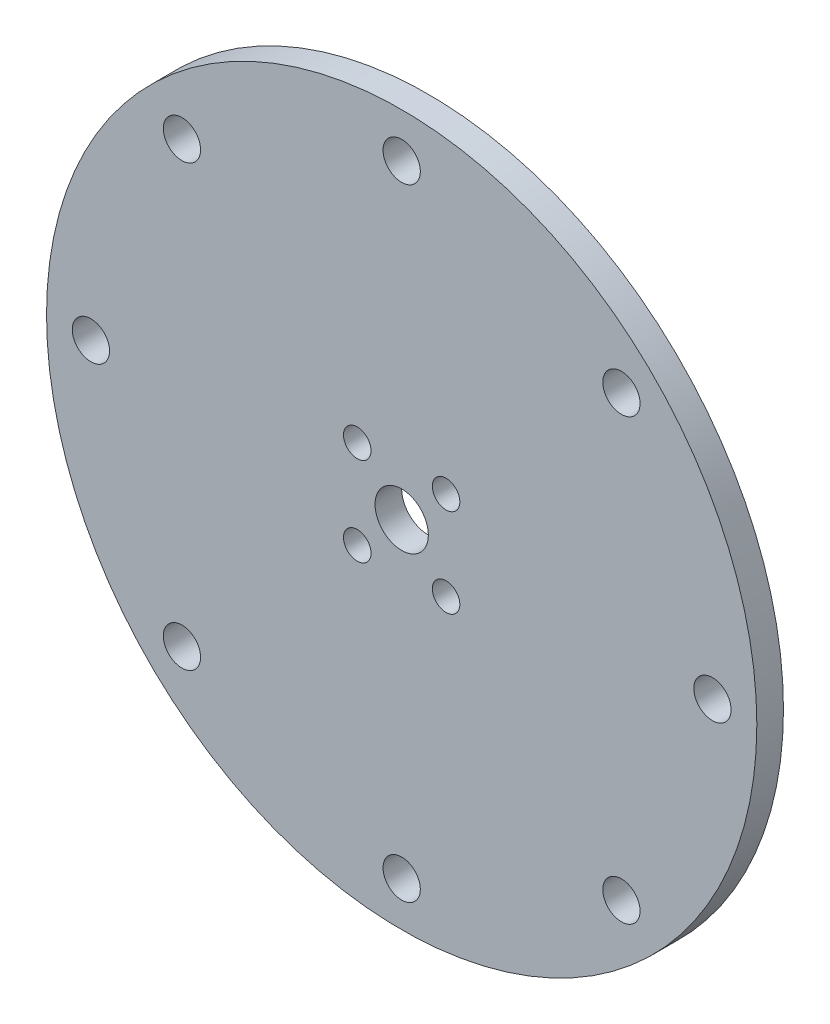
ISO-10303-21;
HEADER;
FILE_DESCRIPTION(('STEP AP214'),'2;1');
FILE_NAME('part.step','',(''),(''),'','','');
FILE_SCHEMA(('AUTOMOTIVE_DESIGN { 1 0 10303 214 1 1 1 1 }'));
ENDSEC;
DATA;
#1=APPLICATION_CONTEXT('core data for automotive mechanical design processes');
#2=APPLICATION_PROTOCOL_DEFINITION('international standard','automotive_design',2000,#1);
#3=PRODUCT_CONTEXT('',#1,'mechanical');
#4=PRODUCT('Part','Part','',(#3));
#5=PRODUCT_RELATED_PRODUCT_CATEGORY('part','',(#4));
#6=PRODUCT_DEFINITION_FORMATION('','',#4);
#7=PRODUCT_DEFINITION_CONTEXT('part definition',#1,'design');
#8=PRODUCT_DEFINITION('design','',#6,#7);
#9=PRODUCT_DEFINITION_SHAPE('','',#8);
#10=(LENGTH_UNIT() NAMED_UNIT(*) SI_UNIT(.MILLI.,.METRE.));
#11=(NAMED_UNIT(*) PLANE_ANGLE_UNIT() SI_UNIT($,.RADIAN.));
#12=(NAMED_UNIT(*) SI_UNIT($,.STERADIAN.) SOLID_ANGLE_UNIT());
#13=UNCERTAINTY_MEASURE_WITH_UNIT(LENGTH_MEASURE(1.E-05),#10,'distance_accuracy_value','');
#14=(GEOMETRIC_REPRESENTATION_CONTEXT(3) GLOBAL_UNCERTAINTY_ASSIGNED_CONTEXT((#13)) GLOBAL_UNIT_ASSIGNED_CONTEXT((#10,
#11,#12)) REPRESENTATION_CONTEXT('',''));
#15=CARTESIAN_POINT('',(0.,0.,0.));
#16=DIRECTION('',(0.,0.,1.));
#17=DIRECTION('',(1.,0.,0.));
#18=AXIS2_PLACEMENT_3D('',#15,#16,#17);
#19=CARTESIAN_POINT('',(0.,0.,3.));
#20=DIRECTION('',(0.,0.,1.));
#21=DIRECTION('',(1.,0.,0.));
#22=AXIS2_PLACEMENT_3D('',#19,#20,#21);
#23=PLANE('',#22);
#24=CARTESIAN_POINT('',(-5.00000000000005,-4.99999999999995,3.));
#25=DIRECTION('',(0.,0.,1.));
#26=DIRECTION('',(1.,0.,0.));
#27=AXIS2_PLACEMENT_3D('',#24,#25,#26);
#28=CIRCLE('',#27,1.55);
#29=CARTESIAN_POINT('',(-3.45000000000005,-4.99999999999995,3.));
#30=VERTEX_POINT('',#29);
#31=EDGE_CURVE('E159',#30,#30,#28,.T.);
#32=ORIENTED_EDGE('',*,*,#31,.F.);
#33=EDGE_LOOP('',(#32));
#34=FACE_BOUND('',#33,.T.);
#35=CARTESIAN_POINT('',(4.99999999999997,-5.00000000000003,3.));
#36=DIRECTION('',(0.,0.,1.));
#37=DIRECTION('',(1.,0.,0.));
#38=AXIS2_PLACEMENT_3D('',#35,#36,#37);
#39=CIRCLE('',#38,1.55);
#40=CARTESIAN_POINT('',(6.54999999999997,-5.00000000000003,3.));
#41=VERTEX_POINT('',#40);
#42=EDGE_CURVE('E163',#41,#41,#39,.T.);
#43=ORIENTED_EDGE('',*,*,#42,.F.);
#44=EDGE_LOOP('',(#43));
#45=FACE_BOUND('',#44,.T.);
#46=CARTESIAN_POINT('',(5.00000000000002,4.99999999999998,3.));
#47=DIRECTION('',(0.,0.,1.));
#48=DIRECTION('',(1.,0.,0.));
#49=AXIS2_PLACEMENT_3D('',#46,#47,#48);
#50=CIRCLE('',#49,1.55);
#51=CARTESIAN_POINT('',(6.55000000000002,4.99999999999998,3.));
#52=VERTEX_POINT('',#51);
#53=EDGE_CURVE('E158',#52,#52,#50,.T.);
#54=ORIENTED_EDGE('',*,*,#53,.F.);
#55=EDGE_LOOP('',(#54));
#56=FACE_BOUND('',#55,.T.);
#57=CARTESIAN_POINT('',(-5.,5.,3.));
#58=DIRECTION('',(0.,0.,1.));
#59=DIRECTION('',(1.,0.,0.));
#60=AXIS2_PLACEMENT_3D('',#57,#58,#59);
#61=CIRCLE('',#60,1.55);
#62=CARTESIAN_POINT('',(-3.45,5.,3.));
#63=VERTEX_POINT('',#62);
#64=EDGE_CURVE('E110',#63,#63,#61,.T.);
#65=ORIENTED_EDGE('',*,*,#64,.F.);
#66=EDGE_LOOP('',(#65));
#67=FACE_BOUND('',#66,.T.);
#68=CARTESIAN_POINT('',(1.17915583062494E-13,35.,3.));
#69=DIRECTION('',(0.,0.,1.));
#70=DIRECTION('',(1.,0.,0.));
#71=AXIS2_PLACEMENT_3D('',#68,#69,#70);
#72=CIRCLE('',#71,2.1);
#73=CARTESIAN_POINT('',(2.10000000000012,35.,3.));
#74=VERTEX_POINT('',#73);
#75=EDGE_CURVE('E78',#74,#74,#72,.T.);
#76=ORIENTED_EDGE('',*,*,#75,.F.);
#77=EDGE_LOOP('',(#76));
#78=FACE_BOUND('',#77,.T.);
#79=CARTESIAN_POINT('',(24.7487373415293,24.748737341529,3.));
#80=DIRECTION('',(0.,0.,1.));
#81=DIRECTION('',(1.,0.,0.));
#82=AXIS2_PLACEMENT_3D('',#79,#80,#81);
#83=CIRCLE('',#82,2.1);
#84=CARTESIAN_POINT('',(26.8487373415293,24.748737341529,3.));
#85=VERTEX_POINT('',#84);
#86=EDGE_CURVE('E148',#85,#85,#83,.T.);
#87=ORIENTED_EDGE('',*,*,#86,.F.);
#88=EDGE_LOOP('',(#87));
#89=FACE_BOUND('',#88,.T.);
#90=CARTESIAN_POINT('',(35.,-2.40117429922004E-13,3.));
#91=DIRECTION('',(0.,0.,1.));
#92=DIRECTION('',(1.,0.,0.));
#93=AXIS2_PLACEMENT_3D('',#90,#91,#92);
#94=CIRCLE('',#93,2.1);
#95=CARTESIAN_POINT('',(37.1,-2.40117429922004E-13,3.));
#96=VERTEX_POINT('',#95);
#97=EDGE_CURVE('E144',#96,#96,#94,.T.);
#98=ORIENTED_EDGE('',*,*,#97,.F.);
#99=EDGE_LOOP('',(#98));
#100=FACE_BOUND('',#99,.T.);
#101=CARTESIAN_POINT('',(24.748737341529,-24.7487373415294,3.));
#102=DIRECTION('',(0.,0.,1.));
#103=DIRECTION('',(1.,0.,0.));
#104=AXIS2_PLACEMENT_3D('',#101,#102,#103);
#105=CIRCLE('',#104,2.1);
#106=CARTESIAN_POINT('',(26.8487373415289,-24.7487373415294,3.));
#107=VERTEX_POINT('',#106);
#108=EDGE_CURVE('E140',#107,#107,#105,.T.);
#109=ORIENTED_EDGE('',*,*,#108,.F.);
#110=EDGE_LOOP('',(#109));
#111=FACE_BOUND('',#110,.T.);
#112=CARTESIAN_POINT('',(-3.62319276781513E-13,-35.,3.));
#113=DIRECTION('',(0.,0.,1.));
#114=DIRECTION('',(1.,0.,0.));
#115=AXIS2_PLACEMENT_3D('',#112,#113,#114);
#116=CIRCLE('',#115,2.1);
#117=CARTESIAN_POINT('',(2.09999999999964,-35.,3.));
#118=VERTEX_POINT('',#117);
#119=EDGE_CURVE('E134',#118,#118,#116,.T.);
#120=ORIENTED_EDGE('',*,*,#119,.F.);
#121=EDGE_LOOP('',(#120));
#122=FACE_BOUND('',#121,.T.);
#123=CARTESIAN_POINT('',(-24.7487373415295,-24.7487373415289,3.));
#124=DIRECTION('',(0.,0.,1.));
#125=DIRECTION('',(1.,0.,0.));
#126=AXIS2_PLACEMENT_3D('',#123,#124,#125);
#127=CIRCLE('',#126,2.1);
#128=CARTESIAN_POINT('',(-22.6487373415295,-24.7487373415289,3.));
#129=VERTEX_POINT('',#128);
#130=EDGE_CURVE('E129',#129,#129,#127,.T.);
#131=ORIENTED_EDGE('',*,*,#130,.F.);
#132=EDGE_LOOP('',(#131));
#133=FACE_BOUND('',#132,.T.);
#134=CARTESIAN_POINT('',(-35.,4.84521123641023E-13,3.));
#135=DIRECTION('',(0.,0.,1.));
#136=DIRECTION('',(1.,0.,0.));
#137=AXIS2_PLACEMENT_3D('',#134,#135,#136);
#138=CIRCLE('',#137,2.1);
#139=CARTESIAN_POINT('',(-32.9,4.84521123641023E-13,3.));
#140=VERTEX_POINT('',#139);
#141=EDGE_CURVE('E124',#140,#140,#138,.T.);
#142=ORIENTED_EDGE('',*,*,#141,.F.);
#143=EDGE_LOOP('',(#142));
#144=FACE_BOUND('',#143,.T.);
#145=CARTESIAN_POINT('',(-24.7487373415288,24.7487373415296,3.));
#146=DIRECTION('',(0.,0.,1.));
#147=DIRECTION('',(1.,0.,0.));
#148=AXIS2_PLACEMENT_3D('',#145,#146,#147);
#149=CIRCLE('',#148,2.1);
#150=CARTESIAN_POINT('',(-22.6487373415288,24.7487373415296,3.));
#151=VERTEX_POINT('',#150);
#152=EDGE_CURVE('E62',#151,#151,#149,.T.);
#153=ORIENTED_EDGE('',*,*,#152,.F.);
#154=EDGE_LOOP('',(#153));
#155=FACE_BOUND('',#154,.T.);
#156=CARTESIAN_POINT('',(0.,0.,3.));
#157=DIRECTION('',(0.,0.,1.));
#158=DIRECTION('',(1.,0.,0.));
#159=AXIS2_PLACEMENT_3D('',#156,#157,#158);
#160=CIRCLE('',#159,40.);
#161=CARTESIAN_POINT('',(40.,0.,3.));
#162=VERTEX_POINT('',#161);
#163=EDGE_CURVE('E68',#162,#162,#160,.T.);
#164=ORIENTED_EDGE('',*,*,#163,.T.);
#165=EDGE_LOOP('',(#164));
#166=FACE_BOUND('',#165,.T.);
#167=CARTESIAN_POINT('',(0.,0.,3.));
#168=DIRECTION('',(0.,0.,1.));
#169=DIRECTION('',(1.,0.,0.));
#170=AXIS2_PLACEMENT_3D('',#167,#168,#169);
#171=CIRCLE('',#170,3.);
#172=CARTESIAN_POINT('',(3.,0.,3.));
#173=VERTEX_POINT('',#172);
#174=EDGE_CURVE('E53',#173,#173,#171,.T.);
#175=ORIENTED_EDGE('',*,*,#174,.F.);
#176=EDGE_LOOP('',(#175));
#177=FACE_BOUND('',#176,.T.);
#178=ADVANCED_FACE('F44',(#34,#45,#56,#67,#78,#89,#100,#111,#122,#133,#144,#155,#166,#177),#23,.T.);
#179=CARTESIAN_POINT('',(0.,0.,0.));
#180=DIRECTION('',(0.,0.,1.));
#181=DIRECTION('',(1.,0.,0.));
#182=AXIS2_PLACEMENT_3D('',#179,#180,#181);
#183=PLANE('',#182);
#184=CARTESIAN_POINT('',(-5.00000000000005,-4.99999999999995,0.));
#185=DIRECTION('',(0.,0.,1.));
#186=DIRECTION('',(1.,0.,0.));
#187=AXIS2_PLACEMENT_3D('',#184,#185,#186);
#188=CIRCLE('',#187,1.55);
#189=CARTESIAN_POINT('',(-3.45000000000005,-4.99999999999995,0.));
#190=VERTEX_POINT('',#189);
#191=EDGE_CURVE('E48',#190,#190,#188,.T.);
#192=ORIENTED_EDGE('',*,*,#191,.T.);
#193=EDGE_LOOP('',(#192));
#194=FACE_BOUND('',#193,.T.);
#195=CARTESIAN_POINT('',(4.99999999999997,-5.00000000000003,0.));
#196=DIRECTION('',(0.,0.,1.));
#197=DIRECTION('',(1.,0.,0.));
#198=AXIS2_PLACEMENT_3D('',#195,#196,#197);
#199=CIRCLE('',#198,1.55);
#200=CARTESIAN_POINT('',(6.54999999999997,-5.00000000000003,0.));
#201=VERTEX_POINT('',#200);
#202=EDGE_CURVE('E113',#201,#201,#199,.T.);
#203=ORIENTED_EDGE('',*,*,#202,.T.);
#204=EDGE_LOOP('',(#203));
#205=FACE_BOUND('',#204,.T.);
#206=CARTESIAN_POINT('',(5.00000000000002,4.99999999999998,0.));
#207=DIRECTION('',(0.,0.,1.));
#208=DIRECTION('',(1.,0.,0.));
#209=AXIS2_PLACEMENT_3D('',#206,#207,#208);
#210=CIRCLE('',#209,1.55);
#211=CARTESIAN_POINT('',(6.55000000000002,4.99999999999998,0.));
#212=VERTEX_POINT('',#211);
#213=EDGE_CURVE('E109',#212,#212,#210,.T.);
#214=ORIENTED_EDGE('',*,*,#213,.T.);
#215=EDGE_LOOP('',(#214));
#216=FACE_BOUND('',#215,.T.);
#217=CARTESIAN_POINT('',(-5.,5.,0.));
#218=DIRECTION('',(0.,0.,1.));
#219=DIRECTION('',(1.,0.,0.));
#220=AXIS2_PLACEMENT_3D('',#217,#218,#219);
#221=CIRCLE('',#220,1.55);
#222=CARTESIAN_POINT('',(-3.45,5.,0.));
#223=VERTEX_POINT('',#222);
#224=EDGE_CURVE('E105',#223,#223,#221,.T.);
#225=ORIENTED_EDGE('',*,*,#224,.T.);
#226=EDGE_LOOP('',(#225));
#227=FACE_BOUND('',#226,.T.);
#228=CARTESIAN_POINT('',(1.17915583062494E-13,35.,0.));
#229=DIRECTION('',(0.,0.,1.));
#230=DIRECTION('',(1.,0.,0.));
#231=AXIS2_PLACEMENT_3D('',#228,#229,#230);
#232=CIRCLE('',#231,2.1);
#233=CARTESIAN_POINT('',(2.10000000000012,35.,0.));
#234=VERTEX_POINT('',#233);
#235=EDGE_CURVE('E72',#234,#234,#232,.T.);
#236=ORIENTED_EDGE('',*,*,#235,.T.);
#237=EDGE_LOOP('',(#236));
#238=FACE_BOUND('',#237,.T.);
#239=CARTESIAN_POINT('',(24.7487373415293,24.748737341529,0.));
#240=DIRECTION('',(0.,0.,1.));
#241=DIRECTION('',(1.,0.,0.));
#242=AXIS2_PLACEMENT_3D('',#239,#240,#241);
#243=CIRCLE('',#242,2.1);
#244=CARTESIAN_POINT('',(26.8487373415293,24.748737341529,0.));
#245=VERTEX_POINT('',#244);
#246=EDGE_CURVE('E98',#245,#245,#243,.T.);
#247=ORIENTED_EDGE('',*,*,#246,.T.);
#248=EDGE_LOOP('',(#247));
#249=FACE_BOUND('',#248,.T.);
#250=CARTESIAN_POINT('',(35.,-2.40117429922004E-13,0.));
#251=DIRECTION('',(0.,0.,1.));
#252=DIRECTION('',(1.,0.,0.));
#253=AXIS2_PLACEMENT_3D('',#250,#251,#252);
#254=CIRCLE('',#253,2.1);
#255=CARTESIAN_POINT('',(37.1,-2.40117429922004E-13,0.));
#256=VERTEX_POINT('',#255);
#257=EDGE_CURVE('E94',#256,#256,#254,.T.);
#258=ORIENTED_EDGE('',*,*,#257,.T.);
#259=EDGE_LOOP('',(#258));
#260=FACE_BOUND('',#259,.T.);
#261=CARTESIAN_POINT('',(24.748737341529,-24.7487373415294,0.));
#262=DIRECTION('',(0.,0.,1.));
#263=DIRECTION('',(1.,0.,0.));
#264=AXIS2_PLACEMENT_3D('',#261,#262,#263);
#265=CIRCLE('',#264,2.1);
#266=CARTESIAN_POINT('',(26.8487373415289,-24.7487373415294,0.));
#267=VERTEX_POINT('',#266);
#268=EDGE_CURVE('E90',#267,#267,#265,.T.);
#269=ORIENTED_EDGE('',*,*,#268,.T.);
#270=EDGE_LOOP('',(#269));
#271=FACE_BOUND('',#270,.T.);
#272=CARTESIAN_POINT('',(-3.62319276781513E-13,-35.,0.));
#273=DIRECTION('',(0.,0.,1.));
#274=DIRECTION('',(1.,0.,0.));
#275=AXIS2_PLACEMENT_3D('',#272,#273,#274);
#276=CIRCLE('',#275,2.1);
#277=CARTESIAN_POINT('',(2.09999999999964,-35.,0.));
#278=VERTEX_POINT('',#277);
#279=EDGE_CURVE('E86',#278,#278,#276,.T.);
#280=ORIENTED_EDGE('',*,*,#279,.T.);
#281=EDGE_LOOP('',(#280));
#282=FACE_BOUND('',#281,.T.);
#283=CARTESIAN_POINT('',(-24.7487373415295,-24.7487373415289,0.));
#284=DIRECTION('',(0.,0.,1.));
#285=DIRECTION('',(1.,0.,0.));
#286=AXIS2_PLACEMENT_3D('',#283,#284,#285);
#287=CIRCLE('',#286,2.1);
#288=CARTESIAN_POINT('',(-22.6487373415295,-24.7487373415289,0.));
#289=VERTEX_POINT('',#288);
#290=EDGE_CURVE('E82',#289,#289,#287,.T.);
#291=ORIENTED_EDGE('',*,*,#290,.T.);
#292=EDGE_LOOP('',(#291));
#293=FACE_BOUND('',#292,.T.);
#294=CARTESIAN_POINT('',(-35.,4.84521123641023E-13,0.));
#295=DIRECTION('',(0.,0.,1.));
#296=DIRECTION('',(1.,0.,0.));
#297=AXIS2_PLACEMENT_3D('',#294,#295,#296);
#298=CIRCLE('',#297,2.1);
#299=CARTESIAN_POINT('',(-32.9,4.84521123641023E-13,0.));
#300=VERTEX_POINT('',#299);
#301=EDGE_CURVE('E77',#300,#300,#298,.T.);
#302=ORIENTED_EDGE('',*,*,#301,.T.);
#303=EDGE_LOOP('',(#302));
#304=FACE_BOUND('',#303,.T.);
#305=CARTESIAN_POINT('',(-24.7487373415288,24.7487373415296,0.));
#306=DIRECTION('',(0.,0.,1.));
#307=DIRECTION('',(1.,0.,0.));
#308=AXIS2_PLACEMENT_3D('',#305,#306,#307);
#309=CIRCLE('',#308,2.1);
#310=CARTESIAN_POINT('',(-22.6487373415288,24.7487373415296,0.));
#311=VERTEX_POINT('',#310);
#312=EDGE_CURVE('E73',#311,#311,#309,.T.);
#313=ORIENTED_EDGE('',*,*,#312,.T.);
#314=EDGE_LOOP('',(#313));
#315=FACE_BOUND('',#314,.T.);
#316=CARTESIAN_POINT('',(0.,0.,0.));
#317=DIRECTION('',(0.,0.,1.));
#318=DIRECTION('',(1.,0.,0.));
#319=AXIS2_PLACEMENT_3D('',#316,#317,#318);
#320=CIRCLE('',#319,3.);
#321=CARTESIAN_POINT('',(3.,0.,0.));
#322=VERTEX_POINT('',#321);
#323=EDGE_CURVE('E59',#322,#322,#320,.T.);
#324=ORIENTED_EDGE('',*,*,#323,.T.);
#325=EDGE_LOOP('',(#324));
#326=FACE_BOUND('',#325,.T.);
#327=CARTESIAN_POINT('',(0.,0.,0.));
#328=DIRECTION('',(0.,0.,1.));
#329=DIRECTION('',(1.,0.,0.));
#330=AXIS2_PLACEMENT_3D('',#327,#328,#329);
#331=CIRCLE('',#330,40.);
#332=CARTESIAN_POINT('',(40.,0.,0.));
#333=VERTEX_POINT('',#332);
#334=EDGE_CURVE('E10',#333,#333,#331,.T.);
#335=ORIENTED_EDGE('',*,*,#334,.F.);
#336=EDGE_LOOP('',(#335));
#337=FACE_BOUND('',#336,.T.);
#338=ADVANCED_FACE('F176',(#194,#205,#216,#227,#238,#249,#260,#271,#282,#293,#304,#315,#326,
#337),#183,.F.);
#339=CARTESIAN_POINT('',(0.,0.,0.));
#340=DIRECTION('',(0.,0.,1.));
#341=DIRECTION('',(1.,0.,0.));
#342=AXIS2_PLACEMENT_3D('',#339,#340,#341);
#343=CYLINDRICAL_SURFACE('',#342,3.);
#344=ORIENTED_EDGE('',*,*,#323,.F.);
#345=EDGE_LOOP('',(#344));
#346=FACE_BOUND('',#345,.T.);
#347=ORIENTED_EDGE('',*,*,#174,.T.);
#348=EDGE_LOOP('',(#347));
#349=FACE_BOUND('',#348,.T.);
#350=ADVANCED_FACE('F199',(#346,#349),#343,.F.);
#351=CARTESIAN_POINT('',(0.,0.,-32.));
#352=DIRECTION('',(0.,0.,1.));
#353=DIRECTION('',(1.,0.,0.));
#354=AXIS2_PLACEMENT_3D('',#351,#352,#353);
#355=CYLINDRICAL_SURFACE('',#354,40.);
#356=ORIENTED_EDGE('',*,*,#163,.F.);
#357=EDGE_LOOP('',(#356));
#358=FACE_BOUND('',#357,.T.);
#359=ORIENTED_EDGE('',*,*,#334,.T.);
#360=EDGE_LOOP('',(#359));
#361=FACE_BOUND('',#360,.T.);
#362=ADVANCED_FACE('F46',(#358,#361),#355,.T.);
#363=CARTESIAN_POINT('',(-24.7487373415288,24.7487373415296,-32.));
#364=DIRECTION('',(0.,0.,1.));
#365=DIRECTION('',(1.,0.,0.));
#366=AXIS2_PLACEMENT_3D('',#363,#364,#365);
#367=CYLINDRICAL_SURFACE('',#366,2.1);
#368=ORIENTED_EDGE('',*,*,#152,.T.);
#369=EDGE_LOOP('',(#368));
#370=FACE_BOUND('',#369,.T.);
#371=ORIENTED_EDGE('',*,*,#312,.F.);
#372=EDGE_LOOP('',(#371));
#373=FACE_BOUND('',#372,.T.);
#374=ADVANCED_FACE('F205',(#370,#373),#367,.F.);
#375=CARTESIAN_POINT('',(-35.,4.84521123641023E-13,-32.));
#376=DIRECTION('',(0.,0.,1.));
#377=DIRECTION('',(1.,0.,0.));
#378=AXIS2_PLACEMENT_3D('',#375,#376,#377);
#379=CYLINDRICAL_SURFACE('',#378,2.1);
#380=ORIENTED_EDGE('',*,*,#141,.T.);
#381=EDGE_LOOP('',(#380));
#382=FACE_BOUND('',#381,.T.);
#383=ORIENTED_EDGE('',*,*,#301,.F.);
#384=EDGE_LOOP('',(#383));
#385=FACE_BOUND('',#384,.T.);
#386=ADVANCED_FACE('F213',(#382,#385),#379,.F.);
#387=CARTESIAN_POINT('',(-24.7487373415295,-24.7487373415289,-32.));
#388=DIRECTION('',(0.,0.,1.));
#389=DIRECTION('',(1.,0.,0.));
#390=AXIS2_PLACEMENT_3D('',#387,#388,#389);
#391=CYLINDRICAL_SURFACE('',#390,2.1);
#392=ORIENTED_EDGE('',*,*,#130,.T.);
#393=EDGE_LOOP('',(#392));
#394=FACE_BOUND('',#393,.T.);
#395=ORIENTED_EDGE('',*,*,#290,.F.);
#396=EDGE_LOOP('',(#395));
#397=FACE_BOUND('',#396,.T.);
#398=ADVANCED_FACE('F216',(#394,#397),#391,.F.);
#399=CARTESIAN_POINT('',(-3.62319276781513E-13,-35.,-32.));
#400=DIRECTION('',(0.,0.,1.));
#401=DIRECTION('',(1.,0.,0.));
#402=AXIS2_PLACEMENT_3D('',#399,#400,#401);
#403=CYLINDRICAL_SURFACE('',#402,2.1);
#404=ORIENTED_EDGE('',*,*,#119,.T.);
#405=EDGE_LOOP('',(#404));
#406=FACE_BOUND('',#405,.T.);
#407=ORIENTED_EDGE('',*,*,#279,.F.);
#408=EDGE_LOOP('',(#407));
#409=FACE_BOUND('',#408,.T.);
#410=ADVANCED_FACE('F219',(#406,#409),#403,.F.);
#411=CARTESIAN_POINT('',(24.748737341529,-24.7487373415294,-32.));
#412=DIRECTION('',(0.,0.,1.));
#413=DIRECTION('',(1.,0.,0.));
#414=AXIS2_PLACEMENT_3D('',#411,#412,#413);
#415=CYLINDRICAL_SURFACE('',#414,2.1);
#416=ORIENTED_EDGE('',*,*,#108,.T.);
#417=EDGE_LOOP('',(#416));
#418=FACE_BOUND('',#417,.T.);
#419=ORIENTED_EDGE('',*,*,#268,.F.);
#420=EDGE_LOOP('',(#419));
#421=FACE_BOUND('',#420,.T.);
#422=ADVANCED_FACE('F223',(#418,#421),#415,.F.);
#423=CARTESIAN_POINT('',(35.,-2.40117429922004E-13,-32.));
#424=DIRECTION('',(0.,0.,1.));
#425=DIRECTION('',(1.,0.,0.));
#426=AXIS2_PLACEMENT_3D('',#423,#424,#425);
#427=CYLINDRICAL_SURFACE('',#426,2.1);
#428=ORIENTED_EDGE('',*,*,#97,.T.);
#429=EDGE_LOOP('',(#428));
#430=FACE_BOUND('',#429,.T.);
#431=ORIENTED_EDGE('',*,*,#257,.F.);
#432=EDGE_LOOP('',(#431));
#433=FACE_BOUND('',#432,.T.);
#434=ADVANCED_FACE('F227',(#430,#433),#427,.F.);
#435=CARTESIAN_POINT('',(24.7487373415293,24.748737341529,-32.));
#436=DIRECTION('',(0.,0.,1.));
#437=DIRECTION('',(1.,0.,0.));
#438=AXIS2_PLACEMENT_3D('',#435,#436,#437);
#439=CYLINDRICAL_SURFACE('',#438,2.1);
#440=ORIENTED_EDGE('',*,*,#86,.T.);
#441=EDGE_LOOP('',(#440));
#442=FACE_BOUND('',#441,.T.);
#443=ORIENTED_EDGE('',*,*,#246,.F.);
#444=EDGE_LOOP('',(#443));
#445=FACE_BOUND('',#444,.T.);
#446=ADVANCED_FACE('F231',(#442,#445),#439,.F.);
#447=CARTESIAN_POINT('',(1.17915583062494E-13,35.,-32.));
#448=DIRECTION('',(0.,0.,1.));
#449=DIRECTION('',(1.,0.,0.));
#450=AXIS2_PLACEMENT_3D('',#447,#448,#449);
#451=CYLINDRICAL_SURFACE('',#450,2.1);
#452=ORIENTED_EDGE('',*,*,#75,.T.);
#453=EDGE_LOOP('',(#452));
#454=FACE_BOUND('',#453,.T.);
#455=ORIENTED_EDGE('',*,*,#235,.F.);
#456=EDGE_LOOP('',(#455));
#457=FACE_BOUND('',#456,.T.);
#458=ADVANCED_FACE('F235',(#454,#457),#451,.F.);
#459=CARTESIAN_POINT('',(-5.,5.,-32.));
#460=DIRECTION('',(0.,0.,1.));
#461=DIRECTION('',(1.,0.,0.));
#462=AXIS2_PLACEMENT_3D('',#459,#460,#461);
#463=CYLINDRICAL_SURFACE('',#462,1.55);
#464=ORIENTED_EDGE('',*,*,#64,.T.);
#465=EDGE_LOOP('',(#464));
#466=FACE_BOUND('',#465,.T.);
#467=ORIENTED_EDGE('',*,*,#224,.F.);
#468=EDGE_LOOP('',(#467));
#469=FACE_BOUND('',#468,.T.);
#470=ADVANCED_FACE('F239',(#466,#469),#463,.F.);
#471=CARTESIAN_POINT('',(5.00000000000002,4.99999999999998,-32.));
#472=DIRECTION('',(0.,0.,1.));
#473=DIRECTION('',(1.,0.,0.));
#474=AXIS2_PLACEMENT_3D('',#471,#472,#473);
#475=CYLINDRICAL_SURFACE('',#474,1.55);
#476=ORIENTED_EDGE('',*,*,#53,.T.);
#477=EDGE_LOOP('',(#476));
#478=FACE_BOUND('',#477,.T.);
#479=ORIENTED_EDGE('',*,*,#213,.F.);
#480=EDGE_LOOP('',(#479));
#481=FACE_BOUND('',#480,.T.);
#482=ADVANCED_FACE('F171',(#478,#481),#475,.F.);
#483=CARTESIAN_POINT('',(4.99999999999997,-5.00000000000003,-32.));
#484=DIRECTION('',(0.,0.,1.));
#485=DIRECTION('',(1.,0.,0.));
#486=AXIS2_PLACEMENT_3D('',#483,#484,#485);
#487=CYLINDRICAL_SURFACE('',#486,1.55);
#488=ORIENTED_EDGE('',*,*,#42,.T.);
#489=EDGE_LOOP('',(#488));
#490=FACE_BOUND('',#489,.T.);
#491=ORIENTED_EDGE('',*,*,#202,.F.);
#492=EDGE_LOOP('',(#491));
#493=FACE_BOUND('',#492,.T.);
#494=ADVANCED_FACE('F247',(#490,#493),#487,.F.);
#495=CARTESIAN_POINT('',(-5.00000000000005,-4.99999999999995,-32.));
#496=DIRECTION('',(0.,0.,1.));
#497=DIRECTION('',(1.,0.,0.));
#498=AXIS2_PLACEMENT_3D('',#495,#496,#497);
#499=CYLINDRICAL_SURFACE('',#498,1.55);
#500=ORIENTED_EDGE('',*,*,#31,.T.);
#501=EDGE_LOOP('',(#500));
#502=FACE_BOUND('',#501,.T.);
#503=ORIENTED_EDGE('',*,*,#191,.F.);
#504=EDGE_LOOP('',(#503));
#505=FACE_BOUND('',#504,.T.);
#506=ADVANCED_FACE('F244',(#502,#505),#499,.F.);
#507=CLOSED_SHELL('',(#178,#338,#350,#362,#374,#386,#398,#410,#422,#434,#446,#458,#470,#482,
#494,#506));
#508=MANIFOLD_SOLID_BREP('B2',#507);
#509=ADVANCED_BREP_SHAPE_REPRESENTATION('',(#18,#508),#14);
#510=SHAPE_DEFINITION_REPRESENTATION(#9,#509);
ENDSEC;
END-ISO-10303-21;
